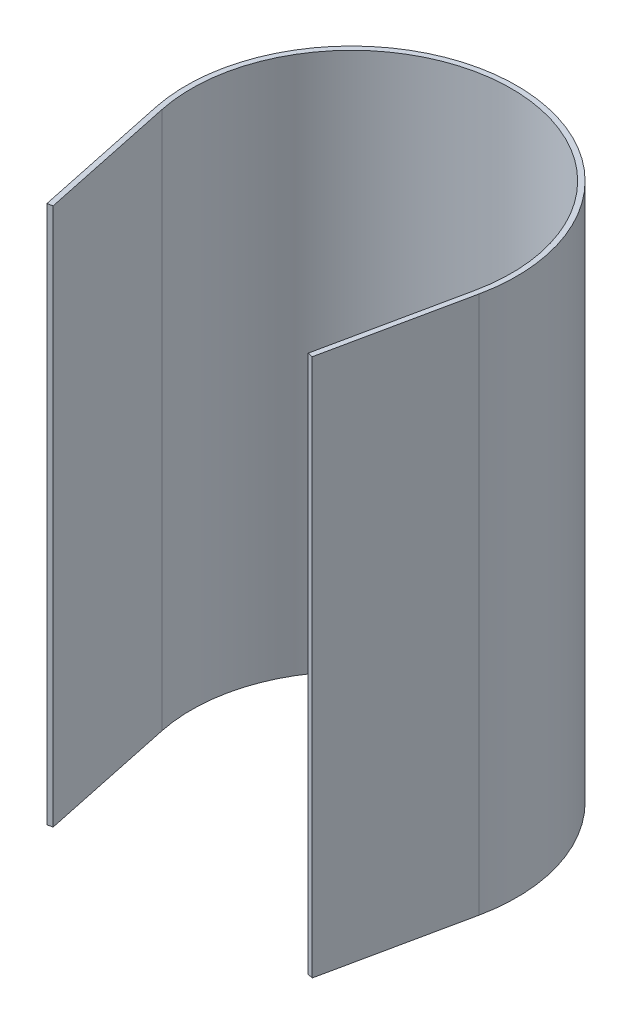
ISO-10303-21;
HEADER;
FILE_DESCRIPTION(('STEP AP214'),'2;1');
FILE_NAME('part.step','',(''),(''),'','','');
FILE_SCHEMA(('AUTOMOTIVE_DESIGN { 1 0 10303 214 1 1 1 1 }'));
ENDSEC;
DATA;
#1=APPLICATION_CONTEXT('core data for automotive mechanical design processes');
#2=APPLICATION_PROTOCOL_DEFINITION('international standard','automotive_design',2000,#1);
#3=PRODUCT_CONTEXT('',#1,'mechanical');
#4=PRODUCT('Part','Part','',(#3));
#5=PRODUCT_RELATED_PRODUCT_CATEGORY('part','',(#4));
#6=PRODUCT_DEFINITION_FORMATION('','',#4);
#7=PRODUCT_DEFINITION_CONTEXT('part definition',#1,'design');
#8=PRODUCT_DEFINITION('design','',#6,#7);
#9=PRODUCT_DEFINITION_SHAPE('','',#8);
#10=(LENGTH_UNIT() NAMED_UNIT(*) SI_UNIT(.MILLI.,.METRE.));
#11=(NAMED_UNIT(*) PLANE_ANGLE_UNIT() SI_UNIT($,.RADIAN.));
#12=(NAMED_UNIT(*) SI_UNIT($,.STERADIAN.) SOLID_ANGLE_UNIT());
#13=UNCERTAINTY_MEASURE_WITH_UNIT(LENGTH_MEASURE(1.E-05),#10,'distance_accuracy_value','');
#14=(GEOMETRIC_REPRESENTATION_CONTEXT(3) GLOBAL_UNCERTAINTY_ASSIGNED_CONTEXT((#13)) GLOBAL_UNIT_ASSIGNED_CONTEXT((#10,
#11,#12)) REPRESENTATION_CONTEXT('',''));
#15=CARTESIAN_POINT('',(0.,0.,0.));
#16=DIRECTION('',(0.,0.,1.));
#17=DIRECTION('',(1.,0.,0.));
#18=AXIS2_PLACEMENT_3D('',#15,#16,#17);
#19=CARTESIAN_POINT('',(-596.526234256321,2050.,125.573133448096));
#20=DIRECTION('',(-0.97855353388504,0.,0.20599267297916));
#21=DIRECTION('',(0.20599267297916,0.,0.97855353388504));
#22=AXIS2_PLACEMENT_3D('',#19,#20,#21);
#23=PLANE('',#22);
#24=DIRECTION('',(-0.20599267297916,0.,-0.97855353388504));
#25=VECTOR('',#24,1.);
#26=CARTESIAN_POINT('',(-596.526234256321,0.,125.573133448096));
#27=LINE('',#26,#25);
#28=CARTESIAN_POINT('',(-485.97758178931,0.,650.726639994256));
#29=VERTEX_POINT('',#28);
#30=CARTESIAN_POINT('',(-596.526234256321,0.,125.573133448096));
#31=VERTEX_POINT('',#30);
#32=EDGE_CURVE('E130',#29,#31,#27,.T.);
#33=ORIENTED_EDGE('',*,*,#32,.T.);
#34=DIRECTION('',(0.,-1.,0.));
#35=VECTOR('',#34,1.);
#36=CARTESIAN_POINT('',(-596.526234256321,2050.,125.573133448096));
#37=LINE('',#36,#35);
#38=CARTESIAN_POINT('',(-596.526234256321,2050.,125.573133448096));
#39=VERTEX_POINT('',#38);
#40=EDGE_CURVE('E11',#39,#31,#37,.T.);
#41=ORIENTED_EDGE('',*,*,#40,.F.);
#42=DIRECTION('',(-0.20599267297916,0.,-0.97855353388504));
#43=VECTOR('',#42,1.);
#44=CARTESIAN_POINT('',(-596.526234256321,2050.,125.573133448096));
#45=LINE('',#44,#43);
#46=CARTESIAN_POINT('',(-485.97758178931,2050.,650.726639994256));
#47=VERTEX_POINT('',#46);
#48=EDGE_CURVE('E144',#47,#39,#45,.T.);
#49=ORIENTED_EDGE('',*,*,#48,.F.);
#50=DIRECTION('',(0.,-1.,0.));
#51=VECTOR('',#50,1.);
#52=CARTESIAN_POINT('',(-485.97758178931,2050.,650.726639994256));
#53=LINE('',#52,#51);
#54=EDGE_CURVE('E126',#47,#29,#53,.T.);
#55=ORIENTED_EDGE('',*,*,#54,.T.);
#56=EDGE_LOOP('',(#33,#41,#49,#55));
#57=FACE_BOUND('',#56,.T.);
#58=ADVANCED_FACE('F34',(#57),#23,.F.);
#59=CARTESIAN_POINT('',(0.,2050.,0.));
#60=DIRECTION('',(0.,-1.,0.));
#61=DIRECTION('',(0.,0.,-1.));
#62=AXIS2_PLACEMENT_3D('',#59,#60,#61);
#63=CYLINDRICAL_SURFACE('',#62,609.6);
#64=CARTESIAN_POINT('',(0.,0.,0.));
#65=DIRECTION('',(0.,-1.,0.));
#66=DIRECTION('',(0.,0.,1.));
#67=AXIS2_PLACEMENT_3D('',#64,#65,#66);
#68=CIRCLE('',#67,609.6);
#69=CARTESIAN_POINT('',(596.526234256321,0.,125.573133448096));
#70=VERTEX_POINT('',#69);
#71=EDGE_CURVE('E133',#31,#70,#68,.T.);
#72=ORIENTED_EDGE('',*,*,#71,.T.);
#73=DIRECTION('',(0.,-1.,0.));
#74=VECTOR('',#73,1.);
#75=CARTESIAN_POINT('',(596.526234256321,2050.,125.573133448096));
#76=LINE('',#75,#74);
#77=CARTESIAN_POINT('',(596.526234256321,2050.,125.573133448096));
#78=VERTEX_POINT('',#77);
#79=EDGE_CURVE('E42',#78,#70,#76,.T.);
#80=ORIENTED_EDGE('',*,*,#79,.F.);
#81=CARTESIAN_POINT('',(0.,2050.,0.));
#82=DIRECTION('',(0.,-1.,0.));
#83=DIRECTION('',(0.,0.,-1.));
#84=AXIS2_PLACEMENT_3D('',#81,#82,#83);
#85=CIRCLE('',#84,609.6);
#86=EDGE_CURVE('E93',#39,#78,#85,.T.);
#87=ORIENTED_EDGE('',*,*,#86,.F.);
#88=ORIENTED_EDGE('',*,*,#40,.T.);
#89=EDGE_LOOP('',(#72,#80,#87,#88));
#90=FACE_BOUND('',#89,.T.);
#91=ADVANCED_FACE('F179',(#90),#63,.F.);
#92=CARTESIAN_POINT('',(596.526234256321,2050.,125.573133448096));
#93=DIRECTION('',(0.97855353388504,0.,0.20599267297916));
#94=DIRECTION('',(0.20599267297916,0.,-0.97855353388504));
#95=AXIS2_PLACEMENT_3D('',#92,#93,#94);
#96=PLANE('',#95);
#97=DIRECTION('',(-0.20599267297916,0.,0.97855353388504));
#98=VECTOR('',#97,1.);
#99=CARTESIAN_POINT('',(596.526234256321,0.,125.573133448096));
#100=LINE('',#99,#98);
#101=CARTESIAN_POINT('',(485.97758178931,0.,650.726639994256));
#102=VERTEX_POINT('',#101);
#103=EDGE_CURVE('E135',#70,#102,#100,.T.);
#104=ORIENTED_EDGE('',*,*,#103,.T.);
#105=DIRECTION('',(0.,-1.,0.));
#106=VECTOR('',#105,1.);
#107=CARTESIAN_POINT('',(485.97758178931,2050.,650.726639994256));
#108=LINE('',#107,#106);
#109=CARTESIAN_POINT('',(485.97758178931,2050.,650.726639994256));
#110=VERTEX_POINT('',#109);
#111=EDGE_CURVE('E151',#110,#102,#108,.T.);
#112=ORIENTED_EDGE('',*,*,#111,.F.);
#113=DIRECTION('',(-0.20599267297916,0.,0.97855353388504));
#114=VECTOR('',#113,1.);
#115=CARTESIAN_POINT('',(596.526234256321,2050.,125.573133448096));
#116=LINE('',#115,#114);
#117=EDGE_CURVE('E159',#78,#110,#116,.T.);
#118=ORIENTED_EDGE('',*,*,#117,.F.);
#119=ORIENTED_EDGE('',*,*,#79,.T.);
#120=EDGE_LOOP('',(#104,#112,#118,#119));
#121=FACE_BOUND('',#120,.T.);
#122=ADVANCED_FACE('F157',(#121),#96,.F.);
#123=CARTESIAN_POINT('',(485.97758178931,2050.,650.726639994256));
#124=DIRECTION('',(0.20599267297916,0.,-0.97855353388504));
#125=DIRECTION('',(-0.97855353388504,0.,-0.205992672979161));
#126=AXIS2_PLACEMENT_3D('',#123,#124,#125);
#127=PLANE('',#126);
#128=DIRECTION('',(0.97855353388504,0.,0.205992672979161));
#129=VECTOR('',#128,1.);
#130=CARTESIAN_POINT('',(485.97758178931,0.,650.726639994256));
#131=LINE('',#130,#129);
#132=CARTESIAN_POINT('',(505.548652467011,0.,654.846493453839));
#133=VERTEX_POINT('',#132);
#134=EDGE_CURVE('E137',#102,#133,#131,.T.);
#135=ORIENTED_EDGE('',*,*,#134,.T.);
#136=DIRECTION('',(0.,-1.,0.));
#137=VECTOR('',#136,1.);
#138=CARTESIAN_POINT('',(505.548652467011,2050.,654.846493453839));
#139=LINE('',#138,#137);
#140=CARTESIAN_POINT('',(505.548652467011,2050.,654.846493453839));
#141=VERTEX_POINT('',#140);
#142=EDGE_CURVE('E148',#141,#133,#139,.T.);
#143=ORIENTED_EDGE('',*,*,#142,.F.);
#144=DIRECTION('',(0.97855353388504,0.,0.205992672979161));
#145=VECTOR('',#144,1.);
#146=CARTESIAN_POINT('',(485.97758178931,2050.,650.726639994256));
#147=LINE('',#146,#145);
#148=EDGE_CURVE('E171',#110,#141,#147,.T.);
#149=ORIENTED_EDGE('',*,*,#148,.F.);
#150=ORIENTED_EDGE('',*,*,#111,.T.);
#151=EDGE_LOOP('',(#135,#143,#149,#150));
#152=FACE_BOUND('',#151,.T.);
#153=ADVANCED_FACE('F167',(#152),#127,.F.);
#154=CARTESIAN_POINT('',(616.097304934021,2050.,129.692986907679));
#155=DIRECTION('',(-0.97855353388504,0.,-0.20599267297916));
#156=DIRECTION('',(-0.20599267297916,0.,0.978553533885041));
#157=AXIS2_PLACEMENT_3D('',#154,#155,#156);
#158=PLANE('',#157);
#159=DIRECTION('',(0.20599267297916,0.,-0.97855353388504));
#160=VECTOR('',#159,1.);
#161=CARTESIAN_POINT('',(616.097304934021,0.,129.692986907679));
#162=LINE('',#161,#160);
#163=CARTESIAN_POINT('',(616.097304934021,0.,129.692986907679));
#164=VERTEX_POINT('',#163);
#165=EDGE_CURVE('E139',#133,#164,#162,.T.);
#166=ORIENTED_EDGE('',*,*,#165,.T.);
#167=DIRECTION('',(0.,-1.,0.));
#168=VECTOR('',#167,1.);
#169=CARTESIAN_POINT('',(616.097304934021,2050.,129.692986907679));
#170=LINE('',#169,#168);
#171=CARTESIAN_POINT('',(616.097304934021,2050.,129.692986907679));
#172=VERTEX_POINT('',#171);
#173=EDGE_CURVE('E121',#172,#164,#170,.T.);
#174=ORIENTED_EDGE('',*,*,#173,.F.);
#175=DIRECTION('',(0.20599267297916,0.,-0.97855353388504));
#176=VECTOR('',#175,1.);
#177=CARTESIAN_POINT('',(616.097304934021,2050.,129.692986907679));
#178=LINE('',#177,#176);
#179=EDGE_CURVE('E112',#141,#172,#178,.T.);
#180=ORIENTED_EDGE('',*,*,#179,.F.);
#181=ORIENTED_EDGE('',*,*,#142,.T.);
#182=EDGE_LOOP('',(#166,#174,#180,#181));
#183=FACE_BOUND('',#182,.T.);
#184=ADVANCED_FACE('F170',(#183),#158,.F.);
#185=CARTESIAN_POINT('',(0.,2050.,0.));
#186=DIRECTION('',(0.,-1.,0.));
#187=DIRECTION('',(0.,0.,-1.));
#188=AXIS2_PLACEMENT_3D('',#185,#186,#187);
#189=CYLINDRICAL_SURFACE('',#188,629.6);
#190=CARTESIAN_POINT('',(0.,0.,0.));
#191=DIRECTION('',(0.,1.,0.));
#192=DIRECTION('',(0.,0.,1.));
#193=AXIS2_PLACEMENT_3D('',#190,#191,#192);
#194=CIRCLE('',#193,629.6);
#195=CARTESIAN_POINT('',(-616.097304934021,0.,129.692986907679));
#196=VERTEX_POINT('',#195);
#197=EDGE_CURVE('E120',#164,#196,#194,.T.);
#198=ORIENTED_EDGE('',*,*,#197,.T.);
#199=DIRECTION('',(0.,-1.,0.));
#200=VECTOR('',#199,1.);
#201=CARTESIAN_POINT('',(-616.097304934021,2050.,129.692986907679));
#202=LINE('',#201,#200);
#203=CARTESIAN_POINT('',(-616.097304934021,2050.,129.692986907679));
#204=VERTEX_POINT('',#203);
#205=EDGE_CURVE('E117',#204,#196,#202,.T.);
#206=ORIENTED_EDGE('',*,*,#205,.F.);
#207=CARTESIAN_POINT('',(0.,2050.,0.));
#208=DIRECTION('',(0.,1.,0.));
#209=DIRECTION('',(0.,0.,1.));
#210=AXIS2_PLACEMENT_3D('',#207,#208,#209);
#211=CIRCLE('',#210,629.6);
#212=EDGE_CURVE('E106',#172,#204,#211,.T.);
#213=ORIENTED_EDGE('',*,*,#212,.F.);
#214=ORIENTED_EDGE('',*,*,#173,.T.);
#215=EDGE_LOOP('',(#198,#206,#213,#214));
#216=FACE_BOUND('',#215,.T.);
#217=ADVANCED_FACE('F118',(#216),#189,.T.);
#218=CARTESIAN_POINT('',(-616.097304934021,2050.,129.692986907679));
#219=DIRECTION('',(0.97855353388504,0.,-0.20599267297916));
#220=DIRECTION('',(-0.20599267297916,0.,-0.97855353388504));
#221=AXIS2_PLACEMENT_3D('',#218,#219,#220);
#222=PLANE('',#221);
#223=DIRECTION('',(0.20599267297916,0.,0.97855353388504));
#224=VECTOR('',#223,1.);
#225=CARTESIAN_POINT('',(-616.097304934021,0.,129.692986907679));
#226=LINE('',#225,#224);
#227=CARTESIAN_POINT('',(-505.548652467011,0.,654.846493453839));
#228=VERTEX_POINT('',#227);
#229=EDGE_CURVE('E79',#196,#228,#226,.T.);
#230=ORIENTED_EDGE('',*,*,#229,.T.);
#231=DIRECTION('',(0.,-1.,0.));
#232=VECTOR('',#231,1.);
#233=CARTESIAN_POINT('',(-505.548652467011,2050.,654.846493453839));
#234=LINE('',#233,#232);
#235=CARTESIAN_POINT('',(-505.548652467011,2050.,654.846493453839));
#236=VERTEX_POINT('',#235);
#237=EDGE_CURVE('E122',#236,#228,#234,.T.);
#238=ORIENTED_EDGE('',*,*,#237,.F.);
#239=DIRECTION('',(0.20599267297916,0.,0.97855353388504));
#240=VECTOR('',#239,1.);
#241=CARTESIAN_POINT('',(-616.097304934021,2050.,129.692986907679));
#242=LINE('',#241,#240);
#243=EDGE_CURVE('E110',#204,#236,#242,.T.);
#244=ORIENTED_EDGE('',*,*,#243,.F.);
#245=ORIENTED_EDGE('',*,*,#205,.T.);
#246=EDGE_LOOP('',(#230,#238,#244,#245));
#247=FACE_BOUND('',#246,.T.);
#248=ADVANCED_FACE('F124',(#247),#222,.F.);
#249=CARTESIAN_POINT('',(-485.97758178931,2050.,650.726639994256));
#250=DIRECTION('',(-0.205992672979155,0.,-0.978553533885041));
#251=DIRECTION('',(-0.978553533885041,0.,0.205992672979155));
#252=AXIS2_PLACEMENT_3D('',#249,#250,#251);
#253=PLANE('',#252);
#254=DIRECTION('',(0.978553533885041,0.,-0.205992672979155));
#255=VECTOR('',#254,1.);
#256=CARTESIAN_POINT('',(-485.97758178931,0.,650.726639994256));
#257=LINE('',#256,#255);
#258=EDGE_CURVE('E85',#228,#29,#257,.T.);
#259=ORIENTED_EDGE('',*,*,#258,.T.);
#260=ORIENTED_EDGE('',*,*,#54,.F.);
#261=DIRECTION('',(0.978553533885041,0.,-0.205992672979155));
#262=VECTOR('',#261,1.);
#263=CARTESIAN_POINT('',(-485.97758178931,2050.,650.726639994256));
#264=LINE('',#263,#262);
#265=EDGE_CURVE('E50',#236,#47,#264,.T.);
#266=ORIENTED_EDGE('',*,*,#265,.F.);
#267=ORIENTED_EDGE('',*,*,#237,.T.);
#268=EDGE_LOOP('',(#259,#260,#266,#267));
#269=FACE_BOUND('',#268,.T.);
#270=ADVANCED_FACE('F195',(#269),#253,.F.);
#271=CARTESIAN_POINT('',(0.,2050.,0.));
#272=DIRECTION('',(0.,1.,0.));
#273=DIRECTION('',(0.,0.,1.));
#274=AXIS2_PLACEMENT_3D('',#271,#272,#273);
#275=PLANE('',#274);
#276=ORIENTED_EDGE('',*,*,#48,.T.);
#277=ORIENTED_EDGE('',*,*,#86,.T.);
#278=ORIENTED_EDGE('',*,*,#117,.T.);
#279=ORIENTED_EDGE('',*,*,#148,.T.);
#280=ORIENTED_EDGE('',*,*,#179,.T.);
#281=ORIENTED_EDGE('',*,*,#212,.T.);
#282=ORIENTED_EDGE('',*,*,#243,.T.);
#283=ORIENTED_EDGE('',*,*,#265,.T.);
#284=EDGE_LOOP('',(#276,#277,#278,#279,#280,#281,#282,#283));
#285=FACE_BOUND('',#284,.T.);
#286=ADVANCED_FACE('F108',(#285),#275,.T.);
#287=CARTESIAN_POINT('',(0.,0.,0.));
#288=DIRECTION('',(0.,1.,0.));
#289=DIRECTION('',(0.,0.,1.));
#290=AXIS2_PLACEMENT_3D('',#287,#288,#289);
#291=PLANE('',#290);
#292=ORIENTED_EDGE('',*,*,#32,.F.);
#293=ORIENTED_EDGE('',*,*,#258,.F.);
#294=ORIENTED_EDGE('',*,*,#229,.F.);
#295=ORIENTED_EDGE('',*,*,#197,.F.);
#296=ORIENTED_EDGE('',*,*,#165,.F.);
#297=ORIENTED_EDGE('',*,*,#134,.F.);
#298=ORIENTED_EDGE('',*,*,#103,.F.);
#299=ORIENTED_EDGE('',*,*,#71,.F.);
#300=EDGE_LOOP('',(#292,#293,#294,#295,#296,#297,#298,#299));
#301=FACE_BOUND('',#300,.T.);
#302=ADVANCED_FACE('F163',(#301),#291,.F.);
#303=CLOSED_SHELL('',(#58,#91,#122,#153,#184,#217,#248,#270,#286,#302));
#304=MANIFOLD_SOLID_BREP('B2',#303);
#305=ADVANCED_BREP_SHAPE_REPRESENTATION('',(#18,#304),#14);
#306=SHAPE_DEFINITION_REPRESENTATION(#9,#305);
ENDSEC;
END-ISO-10303-21;
